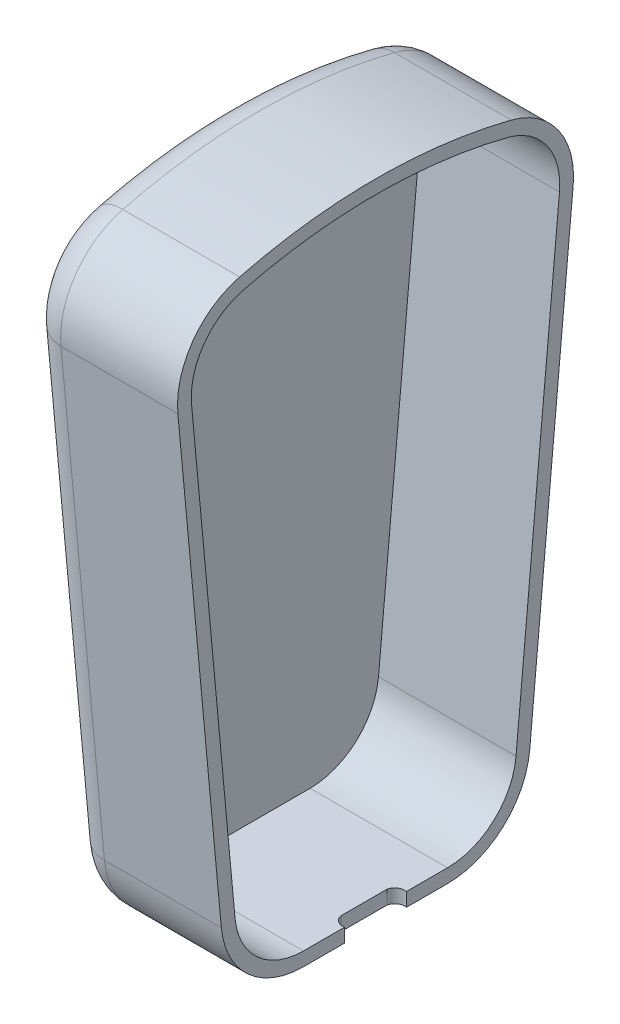
ISO-10303-21;
HEADER;
FILE_DESCRIPTION(('STEP AP214'),'2;1');
FILE_NAME('part.step','',(''),(''),'','','');
FILE_SCHEMA(('AUTOMOTIVE_DESIGN { 1 0 10303 214 1 1 1 1 }'));
ENDSEC;
DATA;
#1=APPLICATION_CONTEXT('core data for automotive mechanical design processes');
#2=APPLICATION_PROTOCOL_DEFINITION('international standard','automotive_design',2000,#1);
#3=PRODUCT_CONTEXT('',#1,'mechanical');
#4=PRODUCT('Part','Part','',(#3));
#5=PRODUCT_RELATED_PRODUCT_CATEGORY('part','',(#4));
#6=PRODUCT_DEFINITION_FORMATION('','',#4);
#7=PRODUCT_DEFINITION_CONTEXT('part definition',#1,'design');
#8=PRODUCT_DEFINITION('design','',#6,#7);
#9=PRODUCT_DEFINITION_SHAPE('','',#8);
#10=(LENGTH_UNIT() NAMED_UNIT(*) SI_UNIT(.MILLI.,.METRE.));
#11=(NAMED_UNIT(*) PLANE_ANGLE_UNIT() SI_UNIT($,.RADIAN.));
#12=(NAMED_UNIT(*) SI_UNIT($,.STERADIAN.) SOLID_ANGLE_UNIT());
#13=UNCERTAINTY_MEASURE_WITH_UNIT(LENGTH_MEASURE(1.E-05),#10,'distance_accuracy_value','');
#14=(GEOMETRIC_REPRESENTATION_CONTEXT(3) GLOBAL_UNCERTAINTY_ASSIGNED_CONTEXT((#13)) GLOBAL_UNIT_ASSIGNED_CONTEXT((#10,
#11,#12)) REPRESENTATION_CONTEXT('',''));
#15=CARTESIAN_POINT('',(0.,0.,0.));
#16=DIRECTION('',(0.,0.,1.));
#17=DIRECTION('',(1.,0.,0.));
#18=AXIS2_PLACEMENT_3D('',#15,#16,#17);
#19=CARTESIAN_POINT('',(20.,31.8416043189372,16.7955360291633));
#20=DIRECTION('',(-1.,0.,0.));
#21=DIRECTION('',(0.,0.,1.));
#22=AXIS2_PLACEMENT_3D('',#19,#20,#21);
#23=CYLINDRICAL_SURFACE('',#22,12.);
#24=DIRECTION('',(-1.,0.,0.));
#25=VECTOR('',#24,1.);
#26=CARTESIAN_POINT('',(20.,43.471195783068,19.7540157700801));
#27=LINE('',#26,#25);
#28=CARTESIAN_POINT('',(20.,43.471195783068,19.7540157700801));
#29=VERTEX_POINT('',#28);
#30=CARTESIAN_POINT('',(3.,43.471195783068,19.7540157700801));
#31=VERTEX_POINT('',#30);
#32=EDGE_CURVE('E334',#29,#31,#27,.T.);
#33=ORIENTED_EDGE('',*,*,#32,.T.);
#34=CARTESIAN_POINT('',(3.,31.8416043189372,16.7955360291633));
#35=DIRECTION('',(1.,0.,0.));
#36=DIRECTION('',(0.,0.,-1.));
#37=AXIS2_PLACEMENT_3D('',#34,#35,#36);
#38=CIRCLE('',#37,12.);
#39=CARTESIAN_POINT('',(2.99999999999999,30.7292959193274,28.7438735714391));
#40=VERTEX_POINT('',#39);
#41=EDGE_CURVE('E11',#31,#40,#38,.T.);
#42=ORIENTED_EDGE('',*,*,#41,.T.);
#43=DIRECTION('',(1.,0.,0.));
#44=VECTOR('',#43,1.);
#45=CARTESIAN_POINT('',(20.,30.7292959193274,28.7438735714391));
#46=LINE('',#45,#44);
#47=CARTESIAN_POINT('',(20.,30.7292959193274,28.7438735714391));
#48=VERTEX_POINT('',#47);
#49=EDGE_CURVE('E329',#48,#40,#46,.F.);
#50=ORIENTED_EDGE('',*,*,#49,.F.);
#51=CARTESIAN_POINT('',(20.,31.8416043189372,16.7955360291633));
#52=DIRECTION('',(1.,0.,0.));
#53=DIRECTION('',(0.,0.,-1.));
#54=AXIS2_PLACEMENT_3D('',#51,#52,#53);
#55=CIRCLE('',#54,12.);
#56=EDGE_CURVE('E328',#29,#48,#55,.T.);
#57=ORIENTED_EDGE('',*,*,#56,.F.);
#58=EDGE_LOOP('',(#33,#42,#50,#57));
#59=FACE_BOUND('',#58,.T.);
#60=ADVANCED_FACE('F39',(#59),#23,.T.);
#61=CARTESIAN_POINT('',(20.,30.7292959193274,28.7438735714391));
#62=DIRECTION('',(0.,0.0926923666341485,-0.995694795189651));
#63=DIRECTION('',(0.,0.995694795189651,0.0926923666341485));
#64=AXIS2_PLACEMENT_3D('',#61,#62,#63);
#65=PLANE('',#64);
#66=ORIENTED_EDGE('',*,*,#49,.T.);
#67=DIRECTION('',(0.,-0.995694795189651,-0.0926923666341485));
#68=VECTOR('',#67,1.);
#69=CARTESIAN_POINT('',(3.,30.7292959193274,28.7438735714391));
#70=LINE('',#69,#68);
#71=CARTESIAN_POINT('',(3.,-37.1678639551653,22.4231129659715));
#72=VERTEX_POINT('',#71);
#73=EDGE_CURVE('E49',#40,#72,#70,.T.);
#74=ORIENTED_EDGE('',*,*,#73,.T.);
#75=DIRECTION('',(-1.,0.,0.));
#76=VECTOR('',#75,1.);
#77=CARTESIAN_POINT('',(20.,-37.1678639551653,22.4231129659715));
#78=LINE('',#77,#76);
#79=CARTESIAN_POINT('',(20.,-37.1678639551653,22.4231129659715));
#80=VERTEX_POINT('',#79);
#81=EDGE_CURVE('E333',#80,#72,#78,.T.);
#82=ORIENTED_EDGE('',*,*,#81,.F.);
#83=DIRECTION('',(0.,-0.995694795189651,-0.0926923666341485));
#84=VECTOR('',#83,1.);
#85=CARTESIAN_POINT('',(20.,30.7292959193274,28.7438735714391));
#86=LINE('',#85,#84);
#87=EDGE_CURVE('E364',#48,#80,#86,.T.);
#88=ORIENTED_EDGE('',*,*,#87,.F.);
#89=EDGE_LOOP('',(#66,#74,#82,#88));
#90=FACE_BOUND('',#89,.T.);
#91=ADVANCED_FACE('F535',(#90),#65,.F.);
#92=CARTESIAN_POINT('',(20.,-36.0555555555556,10.4747754236957));
#93=DIRECTION('',(-1.,0.,0.));
#94=DIRECTION('',(0.,0.,1.));
#95=AXIS2_PLACEMENT_3D('',#92,#93,#94);
#96=CYLINDRICAL_SURFACE('',#95,12.);
#97=ORIENTED_EDGE('',*,*,#81,.T.);
#98=CARTESIAN_POINT('',(3.,-36.0555555555556,10.4747754236957));
#99=DIRECTION('',(1.,0.,0.));
#100=DIRECTION('',(0.,0.,-1.));
#101=AXIS2_PLACEMENT_3D('',#98,#99,#100);
#102=CIRCLE('',#101,12.);
#103=CARTESIAN_POINT('',(3.,-48.0555555555556,10.4747754236956));
#104=VERTEX_POINT('',#103);
#105=EDGE_CURVE('E426',#72,#104,#102,.T.);
#106=ORIENTED_EDGE('',*,*,#105,.T.);
#107=DIRECTION('',(1.,0.,0.));
#108=VECTOR('',#107,1.);
#109=CARTESIAN_POINT('',(20.,-48.0555555555556,10.4747754236956));
#110=LINE('',#109,#108);
#111=CARTESIAN_POINT('',(20.,-48.0555555555556,10.4747754236956));
#112=VERTEX_POINT('',#111);
#113=EDGE_CURVE('E342',#112,#104,#110,.F.);
#114=ORIENTED_EDGE('',*,*,#113,.F.);
#115=CARTESIAN_POINT('',(20.,-36.0555555555556,10.4747754236957));
#116=DIRECTION('',(1.,0.,0.));
#117=DIRECTION('',(0.,0.,-1.));
#118=AXIS2_PLACEMENT_3D('',#115,#116,#117);
#119=CIRCLE('',#118,12.);
#120=EDGE_CURVE('E367',#80,#112,#119,.T.);
#121=ORIENTED_EDGE('',*,*,#120,.F.);
#122=EDGE_LOOP('',(#97,#106,#114,#121));
#123=FACE_BOUND('',#122,.T.);
#124=ADVANCED_FACE('F511',(#123),#96,.T.);
#125=CARTESIAN_POINT('',(20.,-48.0555555555556,10.4747754236956));
#126=DIRECTION('',(0.,1.,0.));
#127=DIRECTION('',(0.,0.,1.));
#128=AXIS2_PLACEMENT_3D('',#125,#126,#127);
#129=PLANE('',#128);
#130=DIRECTION('',(0.,0.,-1.));
#131=VECTOR('',#130,1.);
#132=CARTESIAN_POINT('',(20.,-48.0555555555556,10.4747754236956));
#133=LINE('',#132,#131);
#134=CARTESIAN_POINT('',(20.,-48.0555555555556,-4.50000000000001));
#135=VERTEX_POINT('',#134);
#136=CARTESIAN_POINT('',(20.,-48.0555555555556,-10.4747754236956));
#137=VERTEX_POINT('',#136);
#138=EDGE_CURVE('E370',#135,#137,#133,.T.);
#139=ORIENTED_EDGE('',*,*,#138,.F.);
#140=CARTESIAN_POINT('',(19.7275,-48.0555555555556,-3.0725));
#141=DIRECTION('',(0.,-1.,0.));
#142=DIRECTION('',(0.,0.,-1.));
#143=AXIS2_PLACEMENT_3D('',#140,#141,#142);
#144=CIRCLE('',#143,1.45327647060015);
#145=CARTESIAN_POINT('',(18.3,-48.0555555555556,-3.345));
#146=VERTEX_POINT('',#145);
#147=EDGE_CURVE('E227',#146,#135,#144,.T.);
#148=ORIENTED_EDGE('',*,*,#147,.F.);
#149=DIRECTION('',(0.,0.,-1.));
#150=VECTOR('',#149,1.);
#151=CARTESIAN_POINT('',(18.3,-48.0555555555556,-3.345));
#152=LINE('',#151,#150);
#153=CARTESIAN_POINT('',(18.3,-48.0555555555556,3.345));
#154=VERTEX_POINT('',#153);
#155=EDGE_CURVE('E219',#154,#146,#152,.T.);
#156=ORIENTED_EDGE('',*,*,#155,.F.);
#157=CARTESIAN_POINT('',(19.7275,-48.0555555555556,3.07249999999998));
#158=DIRECTION('',(0.,-1.,0.));
#159=DIRECTION('',(0.,0.,1.));
#160=AXIS2_PLACEMENT_3D('',#157,#158,#159);
#161=CIRCLE('',#160,1.45327647060015);
#162=CARTESIAN_POINT('',(20.,-48.0555555555556,4.5));
#163=VERTEX_POINT('',#162);
#164=EDGE_CURVE('E233',#163,#154,#161,.T.);
#165=ORIENTED_EDGE('',*,*,#164,.F.);
#166=EDGE_CURVE('E371',#112,#163,#133,.T.);
#167=ORIENTED_EDGE('',*,*,#166,.F.);
#168=ORIENTED_EDGE('',*,*,#113,.T.);
#169=DIRECTION('',(0.,0.,-1.));
#170=VECTOR('',#169,1.);
#171=CARTESIAN_POINT('',(3.,-48.0555555555556,10.4747754236956));
#172=LINE('',#171,#170);
#173=CARTESIAN_POINT('',(3.,-48.0555555555556,-10.4747754236956));
#174=VERTEX_POINT('',#173);
#175=EDGE_CURVE('E423',#104,#174,#172,.T.);
#176=ORIENTED_EDGE('',*,*,#175,.T.);
#177=DIRECTION('',(-1.,0.,0.));
#178=VECTOR('',#177,1.);
#179=CARTESIAN_POINT('',(20.,-48.0555555555556,-10.4747754236956));
#180=LINE('',#179,#178);
#181=EDGE_CURVE('E346',#137,#174,#180,.T.);
#182=ORIENTED_EDGE('',*,*,#181,.F.);
#183=EDGE_LOOP('',(#139,#148,#156,#165,#167,#168,#176,#182));
#184=FACE_BOUND('',#183,.T.);
#185=ADVANCED_FACE('F505',(#184),#129,.F.);
#186=CARTESIAN_POINT('',(20.,-36.0555555555556,-10.4747754236957));
#187=DIRECTION('',(-1.,0.,0.));
#188=DIRECTION('',(0.,0.,1.));
#189=AXIS2_PLACEMENT_3D('',#186,#187,#188);
#190=CYLINDRICAL_SURFACE('',#189,12.);
#191=ORIENTED_EDGE('',*,*,#181,.T.);
#192=CARTESIAN_POINT('',(3.,-36.0555555555556,-10.4747754236957));
#193=DIRECTION('',(1.,0.,0.));
#194=DIRECTION('',(0.,0.,-1.));
#195=AXIS2_PLACEMENT_3D('',#192,#193,#194);
#196=CIRCLE('',#195,12.);
#197=CARTESIAN_POINT('',(2.99999999999999,-37.1678639551653,-22.4231129659715));
#198=VERTEX_POINT('',#197);
#199=EDGE_CURVE('E420',#174,#198,#196,.T.);
#200=ORIENTED_EDGE('',*,*,#199,.T.);
#201=DIRECTION('',(1.,0.,0.));
#202=VECTOR('',#201,1.);
#203=CARTESIAN_POINT('',(20.,-37.1678639551653,-22.4231129659715));
#204=LINE('',#203,#202);
#205=CARTESIAN_POINT('',(20.,-37.1678639551653,-22.4231129659715));
#206=VERTEX_POINT('',#205);
#207=EDGE_CURVE('E350',#206,#198,#204,.F.);
#208=ORIENTED_EDGE('',*,*,#207,.F.);
#209=CARTESIAN_POINT('',(20.,-36.0555555555556,-10.4747754236957));
#210=DIRECTION('',(1.,0.,0.));
#211=DIRECTION('',(0.,0.,-1.));
#212=AXIS2_PLACEMENT_3D('',#209,#210,#211);
#213=CIRCLE('',#212,12.);
#214=EDGE_CURVE('E375',#137,#206,#213,.T.);
#215=ORIENTED_EDGE('',*,*,#214,.F.);
#216=EDGE_LOOP('',(#191,#200,#208,#215));
#217=FACE_BOUND('',#216,.T.);
#218=ADVANCED_FACE('F501',(#217),#190,.T.);
#219=CARTESIAN_POINT('',(20.,30.7292959193274,-28.7438735714391));
#220=DIRECTION('',(0.,0.0926923666341485,0.995694795189651));
#221=DIRECTION('',(0.,-0.995694795189651,0.0926923666341485));
#222=AXIS2_PLACEMENT_3D('',#219,#220,#221);
#223=PLANE('',#222);
#224=ORIENTED_EDGE('',*,*,#207,.T.);
#225=DIRECTION('',(0.,0.995694795189651,-0.0926923666341485));
#226=VECTOR('',#225,1.);
#227=CARTESIAN_POINT('',(3.,30.7292959193274,-28.7438735714391));
#228=LINE('',#227,#226);
#229=CARTESIAN_POINT('',(3.,30.7292959193274,-28.7438735714391));
#230=VERTEX_POINT('',#229);
#231=EDGE_CURVE('E417',#198,#230,#228,.T.);
#232=ORIENTED_EDGE('',*,*,#231,.T.);
#233=DIRECTION('',(-1.,0.,0.));
#234=VECTOR('',#233,1.);
#235=CARTESIAN_POINT('',(20.,30.7292959193274,-28.7438735714391));
#236=LINE('',#235,#234);
#237=CARTESIAN_POINT('',(20.,30.7292959193274,-28.7438735714391));
#238=VERTEX_POINT('',#237);
#239=EDGE_CURVE('E354',#238,#230,#236,.T.);
#240=ORIENTED_EDGE('',*,*,#239,.F.);
#241=DIRECTION('',(0.,0.995694795189651,-0.0926923666341485));
#242=VECTOR('',#241,1.);
#243=CARTESIAN_POINT('',(20.,30.7292959193274,-28.7438735714391));
#244=LINE('',#243,#242);
#245=EDGE_CURVE('E378',#206,#238,#244,.T.);
#246=ORIENTED_EDGE('',*,*,#245,.F.);
#247=EDGE_LOOP('',(#224,#232,#240,#246));
#248=FACE_BOUND('',#247,.T.);
#249=ADVANCED_FACE('F499',(#248),#223,.F.);
#250=CARTESIAN_POINT('',(20.,31.8416043189372,-16.7955360291633));
#251=DIRECTION('',(-1.,0.,0.));
#252=DIRECTION('',(0.,0.,1.));
#253=AXIS2_PLACEMENT_3D('',#250,#251,#252);
#254=CYLINDRICAL_SURFACE('',#253,12.);
#255=ORIENTED_EDGE('',*,*,#239,.T.);
#256=CARTESIAN_POINT('',(3.,31.8416043189372,-16.7955360291633));
#257=DIRECTION('',(1.,0.,0.));
#258=DIRECTION('',(0.,0.,-1.));
#259=AXIS2_PLACEMENT_3D('',#256,#257,#258);
#260=CIRCLE('',#259,12.);
#261=CARTESIAN_POINT('',(3.,43.471195783068,-19.7540157700801));
#262=VERTEX_POINT('',#261);
#263=EDGE_CURVE('E414',#230,#262,#260,.T.);
#264=ORIENTED_EDGE('',*,*,#263,.T.);
#265=DIRECTION('',(-1.,0.,0.));
#266=VECTOR('',#265,1.);
#267=CARTESIAN_POINT('',(20.,43.471195783068,-19.7540157700801));
#268=LINE('',#267,#266);
#269=CARTESIAN_POINT('',(20.,43.471195783068,-19.7540157700801));
#270=VERTEX_POINT('',#269);
#271=EDGE_CURVE('E337',#270,#262,#268,.T.);
#272=ORIENTED_EDGE('',*,*,#271,.F.);
#273=CARTESIAN_POINT('',(20.,31.8416043189372,-16.7955360291633));
#274=DIRECTION('',(1.,0.,0.));
#275=DIRECTION('',(0.,0.,-1.));
#276=AXIS2_PLACEMENT_3D('',#273,#274,#275);
#277=CIRCLE('',#276,12.);
#278=EDGE_CURVE('E381',#238,#270,#277,.T.);
#279=ORIENTED_EDGE('',*,*,#278,.F.);
#280=EDGE_LOOP('',(#255,#264,#272,#279));
#281=FACE_BOUND('',#280,.T.);
#282=ADVANCED_FACE('F485',(#281),#254,.T.);
#283=CARTESIAN_POINT('',(20.,-34.1805555555557,0.));
#284=DIRECTION('',(-1.,0.,0.));
#285=DIRECTION('',(0.,0.,1.));
#286=AXIS2_PLACEMENT_3D('',#283,#284,#285);
#287=CYLINDRICAL_SURFACE('',#286,80.1250000000001);
#288=ORIENTED_EDGE('',*,*,#271,.T.);
#289=CARTESIAN_POINT('',(3.,-34.1805555555557,0.));
#290=DIRECTION('',(1.,0.,0.));
#291=DIRECTION('',(0.,0.,-1.));
#292=AXIS2_PLACEMENT_3D('',#289,#290,#291);
#293=CIRCLE('',#292,80.1250000000001);
#294=EDGE_CURVE('E332',#262,#31,#293,.T.);
#295=ORIENTED_EDGE('',*,*,#294,.T.);
#296=ORIENTED_EDGE('',*,*,#32,.F.);
#297=CARTESIAN_POINT('',(20.,-34.1805555555557,0.));
#298=DIRECTION('',(1.,0.,0.));
#299=DIRECTION('',(0.,0.,-1.));
#300=AXIS2_PLACEMENT_3D('',#297,#298,#299);
#301=CIRCLE('',#300,80.1250000000001);
#302=EDGE_CURVE('E338',#270,#29,#301,.T.);
#303=ORIENTED_EDGE('',*,*,#302,.F.);
#304=EDGE_LOOP('',(#288,#295,#296,#303));
#305=FACE_BOUND('',#304,.T.);
#306=ADVANCED_FACE('F490',(#305),#287,.T.);
#307=CARTESIAN_POINT('',(20.,31.8416043189372,16.7955360291633));
#308=DIRECTION('',(1.,0.,0.));
#309=DIRECTION('',(0.,0.,-1.));
#310=AXIS2_PLACEMENT_3D('',#307,#308,#309);
#311=PLANE('',#310);
#312=DIRECTION('',(0.,-1.,0.));
#313=VECTOR('',#312,1.);
#314=CARTESIAN_POINT('',(20.,-36.8457449903294,-4.50000000000001));
#315=LINE('',#314,#313);
#316=CARTESIAN_POINT('',(20.,-46.0555555555556,-4.50000000000001));
#317=VERTEX_POINT('',#316);
#318=EDGE_CURVE('E208',#317,#135,#315,.T.);
#319=ORIENTED_EDGE('',*,*,#318,.T.);
#320=ORIENTED_EDGE('',*,*,#138,.T.);
#321=ORIENTED_EDGE('',*,*,#214,.T.);
#322=ORIENTED_EDGE('',*,*,#245,.T.);
#323=ORIENTED_EDGE('',*,*,#278,.T.);
#324=ORIENTED_EDGE('',*,*,#302,.T.);
#325=ORIENTED_EDGE('',*,*,#56,.T.);
#326=ORIENTED_EDGE('',*,*,#87,.T.);
#327=ORIENTED_EDGE('',*,*,#120,.T.);
#328=ORIENTED_EDGE('',*,*,#166,.T.);
#329=DIRECTION('',(0.,-1.,0.));
#330=VECTOR('',#329,1.);
#331=CARTESIAN_POINT('',(20.,-36.8457449903294,4.5));
#332=LINE('',#331,#330);
#333=CARTESIAN_POINT('',(20.,-46.0555555555556,4.5));
#334=VERTEX_POINT('',#333);
#335=EDGE_CURVE('E236',#334,#163,#332,.T.);
#336=ORIENTED_EDGE('',*,*,#335,.F.);
#337=DIRECTION('',(0.,0.,-1.));
#338=VECTOR('',#337,1.);
#339=CARTESIAN_POINT('',(20.,-46.0555555555556,10.4747754236956));
#340=LINE('',#339,#338);
#341=CARTESIAN_POINT('',(20.,-46.0555555555556,10.4747754236956));
#342=VERTEX_POINT('',#341);
#343=EDGE_CURVE('E256',#342,#334,#340,.T.);
#344=ORIENTED_EDGE('',*,*,#343,.F.);
#345=CARTESIAN_POINT('',(20.,-36.0555555555556,10.4747754236957));
#346=DIRECTION('',(1.,0.,0.));
#347=DIRECTION('',(0.,0.,1.));
#348=AXIS2_PLACEMENT_3D('',#345,#346,#347);
#349=CIRCLE('',#348,10.);
#350=CARTESIAN_POINT('',(20.,-36.982479221897,20.4317233755922));
#351=VERTEX_POINT('',#350);
#352=EDGE_CURVE('E252',#351,#342,#349,.T.);
#353=ORIENTED_EDGE('',*,*,#352,.F.);
#354=DIRECTION('',(0.,-0.995694795189651,-0.0926923666341485));
#355=VECTOR('',#354,1.);
#356=CARTESIAN_POINT('',(20.,30.9146806525957,26.7524839810598));
#357=LINE('',#356,#355);
#358=CARTESIAN_POINT('',(20.,30.9146806525957,26.7524839810598));
#359=VERTEX_POINT('',#358);
#360=EDGE_CURVE('E248',#359,#351,#357,.T.);
#361=ORIENTED_EDGE('',*,*,#360,.F.);
#362=CARTESIAN_POINT('',(20.,31.8416043189372,16.7955360291633));
#363=DIRECTION('',(1.,0.,0.));
#364=DIRECTION('',(0.,0.,-1.));
#365=AXIS2_PLACEMENT_3D('',#362,#363,#364);
#366=CIRCLE('',#365,10.);
#367=CARTESIAN_POINT('',(20.,41.5329305390462,19.2609358132607));
#368=VERTEX_POINT('',#367);
#369=EDGE_CURVE('E245',#368,#359,#366,.T.);
#370=ORIENTED_EDGE('',*,*,#369,.F.);
#371=CARTESIAN_POINT('',(20.,-34.1805555555557,0.));
#372=DIRECTION('',(1.,0.,0.));
#373=DIRECTION('',(0.,0.,1.));
#374=AXIS2_PLACEMENT_3D('',#371,#372,#373);
#375=CIRCLE('',#374,78.1250000000001);
#376=CARTESIAN_POINT('',(20.,41.5329305390462,-19.2609358132606));
#377=VERTEX_POINT('',#376);
#378=EDGE_CURVE('E269',#377,#368,#375,.T.);
#379=ORIENTED_EDGE('',*,*,#378,.F.);
#380=CARTESIAN_POINT('',(20.,31.8416043189372,-16.7955360291633));
#381=DIRECTION('',(1.,0.,0.));
#382=DIRECTION('',(0.,0.,1.));
#383=AXIS2_PLACEMENT_3D('',#380,#381,#382);
#384=CIRCLE('',#383,10.);
#385=CARTESIAN_POINT('',(20.,30.9146806525957,-26.7524839810598));
#386=VERTEX_POINT('',#385);
#387=EDGE_CURVE('E265',#386,#377,#384,.T.);
#388=ORIENTED_EDGE('',*,*,#387,.F.);
#389=DIRECTION('',(0.,0.995694795189651,-0.0926923666341485));
#390=VECTOR('',#389,1.);
#391=CARTESIAN_POINT('',(20.,30.9146806525957,-26.7524839810598));
#392=LINE('',#391,#390);
#393=CARTESIAN_POINT('',(20.,-36.982479221897,-20.4317233755922));
#394=VERTEX_POINT('',#393);
#395=EDGE_CURVE('E262',#394,#386,#392,.T.);
#396=ORIENTED_EDGE('',*,*,#395,.F.);
#397=CARTESIAN_POINT('',(20.,-36.0555555555556,-10.4747754236957));
#398=DIRECTION('',(1.,0.,0.));
#399=DIRECTION('',(0.,0.,1.));
#400=AXIS2_PLACEMENT_3D('',#397,#398,#399);
#401=CIRCLE('',#400,10.);
#402=CARTESIAN_POINT('',(20.,-46.0555555555556,-10.4747754236956));
#403=VERTEX_POINT('',#402);
#404=EDGE_CURVE('E259',#403,#394,#401,.T.);
#405=ORIENTED_EDGE('',*,*,#404,.F.);
#406=EDGE_CURVE('E255',#317,#403,#340,.T.);
#407=ORIENTED_EDGE('',*,*,#406,.F.);
#408=EDGE_LOOP('',(#319,#320,#321,#322,#323,#324,#325,#326,#327,#328,#336,#344,#353,#361,#370,
#379,#388,#396,#405,#407));
#409=FACE_BOUND('',#408,.T.);
#410=ADVANCED_FACE('F494',(#409),#311,.T.);
#411=CARTESIAN_POINT('',(-2.,31.8416043189372,16.7955360291633));
#412=DIRECTION('',(1.,0.,0.));
#413=DIRECTION('',(0.,0.,-1.));
#414=AXIS2_PLACEMENT_3D('',#411,#412,#413);
#415=PLANE('',#414);
#416=CARTESIAN_POINT('',(-2.,31.8416043189372,16.7955360291633));
#417=DIRECTION('',(1.,0.,0.));
#418=DIRECTION('',(0.,0.,-1.));
#419=AXIS2_PLACEMENT_3D('',#416,#417,#418);
#420=CIRCLE('',#419,7.00000000000001);
#421=CARTESIAN_POINT('',(-2.,31.1927577524981,23.7653995954908));
#422=VERTEX_POINT('',#421);
#423=CARTESIAN_POINT('',(-2.,38.6255326730135,18.5213158780314));
#424=VERTEX_POINT('',#423);
#425=EDGE_CURVE('E389',#422,#424,#420,.F.);
#426=ORIENTED_EDGE('',*,*,#425,.T.);
#427=CARTESIAN_POINT('',(-2.,-34.1805555555557,0.));
#428=DIRECTION('',(1.,0.,0.));
#429=DIRECTION('',(0.,0.,-1.));
#430=AXIS2_PLACEMENT_3D('',#427,#428,#429);
#431=CIRCLE('',#430,75.1250000000001);
#432=CARTESIAN_POINT('',(-2.,38.6255326730135,-18.5213158780314));
#433=VERTEX_POINT('',#432);
#434=EDGE_CURVE('E410',#424,#433,#431,.F.);
#435=ORIENTED_EDGE('',*,*,#434,.T.);
#436=CARTESIAN_POINT('',(-2.,31.8416043189372,-16.7955360291633));
#437=DIRECTION('',(1.,0.,0.));
#438=DIRECTION('',(0.,0.,-1.));
#439=AXIS2_PLACEMENT_3D('',#436,#437,#438);
#440=CIRCLE('',#439,7.00000000000001);
#441=CARTESIAN_POINT('',(-2.,31.1927577524981,-23.7653995954908));
#442=VERTEX_POINT('',#441);
#443=EDGE_CURVE('E407',#433,#442,#440,.F.);
#444=ORIENTED_EDGE('',*,*,#443,.T.);
#445=DIRECTION('',(0.,0.995694795189651,-0.0926923666341485));
#446=VECTOR('',#445,1.);
#447=CARTESIAN_POINT('',(-2.,28.0925266261759,-23.476789308885));
#448=LINE('',#447,#446);
#449=CARTESIAN_POINT('',(-2.,-36.7044021219945,-17.4446389900232));
#450=VERTEX_POINT('',#449);
#451=EDGE_CURVE('E404',#442,#450,#448,.F.);
#452=ORIENTED_EDGE('',*,*,#451,.T.);
#453=CARTESIAN_POINT('',(-2.,-36.0555555555556,-10.4747754236957));
#454=DIRECTION('',(1.,0.,0.));
#455=DIRECTION('',(0.,0.,-1.));
#456=AXIS2_PLACEMENT_3D('',#453,#454,#455);
#457=CIRCLE('',#456,7.);
#458=CARTESIAN_POINT('',(-2.,-43.0555555555556,-10.4747754236956));
#459=VERTEX_POINT('',#458);
#460=EDGE_CURVE('E401',#450,#459,#457,.F.);
#461=ORIENTED_EDGE('',*,*,#460,.T.);
#462=DIRECTION('',(0.,0.,-1.));
#463=VECTOR('',#462,1.);
#464=CARTESIAN_POINT('',(-2.,-43.0555555555556,16.7955360291633));
#465=LINE('',#464,#463);
#466=CARTESIAN_POINT('',(-2.,-43.0555555555556,10.4747754236956));
#467=VERTEX_POINT('',#466);
#468=EDGE_CURVE('E398',#459,#467,#465,.F.);
#469=ORIENTED_EDGE('',*,*,#468,.T.);
#470=CARTESIAN_POINT('',(-2.,-36.0555555555556,10.4747754236957));
#471=DIRECTION('',(1.,0.,0.));
#472=DIRECTION('',(0.,0.,-1.));
#473=AXIS2_PLACEMENT_3D('',#470,#471,#472);
#474=CIRCLE('',#473,7.);
#475=CARTESIAN_POINT('',(-2.,-36.7044021219946,17.4446389900232));
#476=VERTEX_POINT('',#475);
#477=EDGE_CURVE('E395',#467,#476,#474,.F.);
#478=ORIENTED_EDGE('',*,*,#477,.T.);
#479=DIRECTION('',(0.,-0.995694795189651,-0.0926923666341485));
#480=VECTOR('',#479,1.);
#481=CARTESIAN_POINT('',(-2.,31.1927577524981,23.7653995954908));
#482=LINE('',#481,#480);
#483=EDGE_CURVE('E392',#476,#422,#482,.F.);
#484=ORIENTED_EDGE('',*,*,#483,.T.);
#485=EDGE_LOOP('',(#426,#435,#444,#452,#461,#469,#478,#484));
#486=FACE_BOUND('',#485,.T.);
#487=ADVANCED_FACE('F470',(#486),#415,.F.);
#488=CARTESIAN_POINT('',(20.,31.8416043189372,16.7955360291633));
#489=DIRECTION('',(-1.,0.,0.));
#490=DIRECTION('',(0.,0.,1.));
#491=AXIS2_PLACEMENT_3D('',#488,#489,#490);
#492=CYLINDRICAL_SURFACE('',#491,10.);
#493=CARTESIAN_POINT('',(0.,31.8416043189372,16.7955360291633));
#494=DIRECTION('',(1.,0.,0.));
#495=DIRECTION('',(0.,0.,-1.));
#496=AXIS2_PLACEMENT_3D('',#493,#494,#495);
#497=CIRCLE('',#496,10.);
#498=CARTESIAN_POINT('',(0.,41.5329305390462,19.2609358132607));
#499=VERTEX_POINT('',#498);
#500=CARTESIAN_POINT('',(0.,30.9146806525957,26.7524839810598));
#501=VERTEX_POINT('',#500);
#502=EDGE_CURVE('E273',#499,#501,#497,.T.);
#503=ORIENTED_EDGE('',*,*,#502,.F.);
#504=DIRECTION('',(-1.,0.,0.));
#505=VECTOR('',#504,1.);
#506=CARTESIAN_POINT('',(20.,41.5329305390462,19.2609358132607));
#507=LINE('',#506,#505);
#508=EDGE_CURVE('E272',#368,#499,#507,.T.);
#509=ORIENTED_EDGE('',*,*,#508,.F.);
#510=ORIENTED_EDGE('',*,*,#369,.T.);
#511=DIRECTION('',(-1.,0.,0.));
#512=VECTOR('',#511,1.);
#513=CARTESIAN_POINT('',(20.,30.9146806525957,26.7524839810598));
#514=LINE('',#513,#512);
#515=EDGE_CURVE('E324',#359,#501,#514,.T.);
#516=ORIENTED_EDGE('',*,*,#515,.T.);
#517=EDGE_LOOP('',(#503,#509,#510,#516));
#518=FACE_BOUND('',#517,.T.);
#519=ADVANCED_FACE('F558',(#518),#492,.F.);
#520=CARTESIAN_POINT('',(20.,30.9146806525957,26.7524839810598));
#521=DIRECTION('',(0.,0.0926923666341485,-0.995694795189651));
#522=DIRECTION('',(0.,0.995694795189651,0.0926923666341485));
#523=AXIS2_PLACEMENT_3D('',#520,#521,#522);
#524=PLANE('',#523);
#525=DIRECTION('',(0.,-0.995694795189651,-0.0926923666341485));
#526=VECTOR('',#525,1.);
#527=CARTESIAN_POINT('',(0.,30.9146806525957,26.7524839810598));
#528=LINE('',#527,#526);
#529=CARTESIAN_POINT('',(0.,-36.982479221897,20.4317233755922));
#530=VERTEX_POINT('',#529);
#531=EDGE_CURVE('E277',#501,#530,#528,.T.);
#532=ORIENTED_EDGE('',*,*,#531,.F.);
#533=ORIENTED_EDGE('',*,*,#515,.F.);
#534=ORIENTED_EDGE('',*,*,#360,.T.);
#535=DIRECTION('',(-1.,0.,0.));
#536=VECTOR('',#535,1.);
#537=CARTESIAN_POINT('',(20.,-36.982479221897,20.4317233755922));
#538=LINE('',#537,#536);
#539=EDGE_CURVE('E320',#351,#530,#538,.T.);
#540=ORIENTED_EDGE('',*,*,#539,.T.);
#541=EDGE_LOOP('',(#532,#533,#534,#540));
#542=FACE_BOUND('',#541,.T.);
#543=ADVANCED_FACE('F563',(#542),#524,.T.);
#544=CARTESIAN_POINT('',(20.,-36.0555555555556,10.4747754236957));
#545=DIRECTION('',(-1.,0.,0.));
#546=DIRECTION('',(0.,0.,1.));
#547=AXIS2_PLACEMENT_3D('',#544,#545,#546);
#548=CYLINDRICAL_SURFACE('',#547,10.);
#549=CARTESIAN_POINT('',(0.,-36.0555555555556,10.4747754236957));
#550=DIRECTION('',(1.,0.,0.));
#551=DIRECTION('',(0.,0.,1.));
#552=AXIS2_PLACEMENT_3D('',#549,#550,#551);
#553=CIRCLE('',#552,10.);
#554=CARTESIAN_POINT('',(0.,-46.0555555555556,10.4747754236956));
#555=VERTEX_POINT('',#554);
#556=EDGE_CURVE('E280',#530,#555,#553,.T.);
#557=ORIENTED_EDGE('',*,*,#556,.F.);
#558=ORIENTED_EDGE('',*,*,#539,.F.);
#559=ORIENTED_EDGE('',*,*,#352,.T.);
#560=DIRECTION('',(-1.,0.,0.));
#561=VECTOR('',#560,1.);
#562=CARTESIAN_POINT('',(20.,-46.0555555555556,10.4747754236956));
#563=LINE('',#562,#561);
#564=EDGE_CURVE('E316',#342,#555,#563,.T.);
#565=ORIENTED_EDGE('',*,*,#564,.T.);
#566=EDGE_LOOP('',(#557,#558,#559,#565));
#567=FACE_BOUND('',#566,.T.);
#568=ADVANCED_FACE('F577',(#567),#548,.F.);
#569=CARTESIAN_POINT('',(20.,-46.0555555555556,10.4747754236956));
#570=DIRECTION('',(0.,1.,0.));
#571=DIRECTION('',(0.,0.,1.));
#572=AXIS2_PLACEMENT_3D('',#569,#570,#571);
#573=PLANE('',#572);
#574=CARTESIAN_POINT('',(19.7275,-46.0555555555556,-3.0725));
#575=DIRECTION('',(0.,1.,0.));
#576=DIRECTION('',(0.,0.,1.));
#577=AXIS2_PLACEMENT_3D('',#574,#575,#576);
#578=CIRCLE('',#577,1.45327647060015);
#579=CARTESIAN_POINT('',(18.3,-46.0555555555556,-3.345));
#580=VERTEX_POINT('',#579);
#581=EDGE_CURVE('E202',#580,#317,#578,.F.);
#582=ORIENTED_EDGE('',*,*,#581,.T.);
#583=ORIENTED_EDGE('',*,*,#406,.T.);
#584=DIRECTION('',(-1.,0.,0.));
#585=VECTOR('',#584,1.);
#586=CARTESIAN_POINT('',(20.,-46.0555555555556,-10.4747754236956));
#587=LINE('',#586,#585);
#588=CARTESIAN_POINT('',(0.,-46.0555555555556,-10.4747754236956));
#589=VERTEX_POINT('',#588);
#590=EDGE_CURVE('E312',#403,#589,#587,.T.);
#591=ORIENTED_EDGE('',*,*,#590,.T.);
#592=DIRECTION('',(0.,0.,-1.));
#593=VECTOR('',#592,1.);
#594=CARTESIAN_POINT('',(0.,-46.0555555555556,10.4747754236956));
#595=LINE('',#594,#593);
#596=EDGE_CURVE('E283',#555,#589,#595,.T.);
#597=ORIENTED_EDGE('',*,*,#596,.F.);
#598=ORIENTED_EDGE('',*,*,#564,.F.);
#599=ORIENTED_EDGE('',*,*,#343,.T.);
#600=CARTESIAN_POINT('',(19.7275,-46.0555555555556,3.07249999999998));
#601=DIRECTION('',(0.,1.,0.));
#602=DIRECTION('',(0.,0.,1.));
#603=AXIS2_PLACEMENT_3D('',#600,#601,#602);
#604=CIRCLE('',#603,1.45327647060015);
#605=CARTESIAN_POINT('',(18.3,-46.0555555555556,3.345));
#606=VERTEX_POINT('',#605);
#607=EDGE_CURVE('E225',#334,#606,#604,.F.);
#608=ORIENTED_EDGE('',*,*,#607,.T.);
#609=DIRECTION('',(0.,0.,-1.));
#610=VECTOR('',#609,1.);
#611=CARTESIAN_POINT('',(18.3,-46.0555555555556,-3.345));
#612=LINE('',#611,#610);
#613=EDGE_CURVE('E216',#606,#580,#612,.T.);
#614=ORIENTED_EDGE('',*,*,#613,.T.);
#615=EDGE_LOOP('',(#582,#583,#591,#597,#598,#599,#608,#614));
#616=FACE_BOUND('',#615,.T.);
#617=ADVANCED_FACE('F223',(#616),#573,.T.);
#618=CARTESIAN_POINT('',(20.,-36.0555555555556,-10.4747754236957));
#619=DIRECTION('',(-1.,0.,0.));
#620=DIRECTION('',(0.,0.,1.));
#621=AXIS2_PLACEMENT_3D('',#618,#619,#620);
#622=CYLINDRICAL_SURFACE('',#621,10.);
#623=CARTESIAN_POINT('',(0.,-36.0555555555556,-10.4747754236957));
#624=DIRECTION('',(1.,0.,0.));
#625=DIRECTION('',(0.,0.,1.));
#626=AXIS2_PLACEMENT_3D('',#623,#624,#625);
#627=CIRCLE('',#626,10.);
#628=CARTESIAN_POINT('',(0.,-36.982479221897,-20.4317233755922));
#629=VERTEX_POINT('',#628);
#630=EDGE_CURVE('E286',#589,#629,#627,.T.);
#631=ORIENTED_EDGE('',*,*,#630,.F.);
#632=ORIENTED_EDGE('',*,*,#590,.F.);
#633=ORIENTED_EDGE('',*,*,#404,.T.);
#634=DIRECTION('',(-1.,0.,0.));
#635=VECTOR('',#634,1.);
#636=CARTESIAN_POINT('',(20.,-36.982479221897,-20.4317233755922));
#637=LINE('',#636,#635);
#638=EDGE_CURVE('E308',#394,#629,#637,.T.);
#639=ORIENTED_EDGE('',*,*,#638,.T.);
#640=EDGE_LOOP('',(#631,#632,#633,#639));
#641=FACE_BOUND('',#640,.T.);
#642=ADVANCED_FACE('F576',(#641),#622,.F.);
#643=CARTESIAN_POINT('',(20.,30.9146806525957,-26.7524839810598));
#644=DIRECTION('',(0.,0.0926923666341485,0.995694795189651));
#645=DIRECTION('',(0.,-0.995694795189651,0.0926923666341485));
#646=AXIS2_PLACEMENT_3D('',#643,#644,#645);
#647=PLANE('',#646);
#648=DIRECTION('',(0.,0.995694795189651,-0.0926923666341485));
#649=VECTOR('',#648,1.);
#650=CARTESIAN_POINT('',(0.,30.9146806525957,-26.7524839810598));
#651=LINE('',#650,#649);
#652=CARTESIAN_POINT('',(0.,30.9146806525957,-26.7524839810598));
#653=VERTEX_POINT('',#652);
#654=EDGE_CURVE('E289',#629,#653,#651,.T.);
#655=ORIENTED_EDGE('',*,*,#654,.F.);
#656=ORIENTED_EDGE('',*,*,#638,.F.);
#657=ORIENTED_EDGE('',*,*,#395,.T.);
#658=DIRECTION('',(-1.,0.,0.));
#659=VECTOR('',#658,1.);
#660=CARTESIAN_POINT('',(20.,30.9146806525957,-26.7524839810598));
#661=LINE('',#660,#659);
#662=EDGE_CURVE('E304',#386,#653,#661,.T.);
#663=ORIENTED_EDGE('',*,*,#662,.T.);
#664=EDGE_LOOP('',(#655,#656,#657,#663));
#665=FACE_BOUND('',#664,.T.);
#666=ADVANCED_FACE('F620',(#665),#647,.T.);
#667=CARTESIAN_POINT('',(20.,31.8416043189372,-16.7955360291633));
#668=DIRECTION('',(-1.,0.,0.));
#669=DIRECTION('',(0.,0.,1.));
#670=AXIS2_PLACEMENT_3D('',#667,#668,#669);
#671=CYLINDRICAL_SURFACE('',#670,10.);
#672=CARTESIAN_POINT('',(0.,31.8416043189372,-16.7955360291633));
#673=DIRECTION('',(1.,0.,0.));
#674=DIRECTION('',(0.,0.,1.));
#675=AXIS2_PLACEMENT_3D('',#672,#673,#674);
#676=CIRCLE('',#675,10.);
#677=CARTESIAN_POINT('',(0.,41.5329305390462,-19.2609358132606));
#678=VERTEX_POINT('',#677);
#679=EDGE_CURVE('E292',#653,#678,#676,.T.);
#680=ORIENTED_EDGE('',*,*,#679,.F.);
#681=ORIENTED_EDGE('',*,*,#662,.F.);
#682=ORIENTED_EDGE('',*,*,#387,.T.);
#683=DIRECTION('',(-1.,0.,0.));
#684=VECTOR('',#683,1.);
#685=CARTESIAN_POINT('',(20.,41.5329305390462,-19.2609358132606));
#686=LINE('',#685,#684);
#687=EDGE_CURVE('E300',#377,#678,#686,.T.);
#688=ORIENTED_EDGE('',*,*,#687,.T.);
#689=EDGE_LOOP('',(#680,#681,#682,#688));
#690=FACE_BOUND('',#689,.T.);
#691=ADVANCED_FACE('F616',(#690),#671,.F.);
#692=CARTESIAN_POINT('',(20.,-34.1805555555557,0.));
#693=DIRECTION('',(-1.,0.,0.));
#694=DIRECTION('',(0.,0.,1.));
#695=AXIS2_PLACEMENT_3D('',#692,#693,#694);
#696=CYLINDRICAL_SURFACE('',#695,78.1250000000001);
#697=CARTESIAN_POINT('',(0.,-34.1805555555557,0.));
#698=DIRECTION('',(1.,0.,0.));
#699=DIRECTION('',(0.,0.,1.));
#700=AXIS2_PLACEMENT_3D('',#697,#698,#699);
#701=CIRCLE('',#700,78.1250000000001);
#702=EDGE_CURVE('E249',#678,#499,#701,.T.);
#703=ORIENTED_EDGE('',*,*,#702,.F.);
#704=ORIENTED_EDGE('',*,*,#687,.F.);
#705=ORIENTED_EDGE('',*,*,#378,.T.);
#706=ORIENTED_EDGE('',*,*,#508,.T.);
#707=EDGE_LOOP('',(#703,#704,#705,#706));
#708=FACE_BOUND('',#707,.T.);
#709=ADVANCED_FACE('F612',(#708),#696,.F.);
#710=CARTESIAN_POINT('',(0.,31.8416043189372,16.7955360291633));
#711=DIRECTION('',(1.,0.,0.));
#712=DIRECTION('',(0.,0.,-1.));
#713=AXIS2_PLACEMENT_3D('',#710,#711,#712);
#714=PLANE('',#713);
#715=ORIENTED_EDGE('',*,*,#502,.T.);
#716=ORIENTED_EDGE('',*,*,#531,.T.);
#717=ORIENTED_EDGE('',*,*,#556,.T.);
#718=ORIENTED_EDGE('',*,*,#596,.T.);
#719=ORIENTED_EDGE('',*,*,#630,.T.);
#720=ORIENTED_EDGE('',*,*,#654,.T.);
#721=ORIENTED_EDGE('',*,*,#679,.T.);
#722=ORIENTED_EDGE('',*,*,#702,.T.);
#723=EDGE_LOOP('',(#715,#716,#717,#718,#719,#720,#721,#722));
#724=FACE_BOUND('',#723,.T.);
#725=ADVANCED_FACE('F609',(#724),#714,.T.);
#726=CARTESIAN_POINT('',(3.,-43.0555555555556,10.4747754236956));
#727=DIRECTION('',(0.,0.,-1.));
#728=DIRECTION('',(-1.,0.,0.));
#729=AXIS2_PLACEMENT_3D('',#726,#727,#728);
#730=CYLINDRICAL_SURFACE('',#729,5.);
#731=CARTESIAN_POINT('',(3.,-43.0555555555556,10.4747754236956));
#732=DIRECTION('',(0.,0.,1.));
#733=DIRECTION('',(1.,0.,0.));
#734=AXIS2_PLACEMENT_3D('',#731,#732,#733);
#735=CIRCLE('',#734,5.);
#736=EDGE_CURVE('E451',#467,#104,#735,.T.);
#737=ORIENTED_EDGE('',*,*,#736,.F.);
#738=ORIENTED_EDGE('',*,*,#468,.F.);
#739=CARTESIAN_POINT('',(3.,-43.0555555555556,-10.4747754236956));
#740=DIRECTION('',(0.,0.,-1.));
#741=DIRECTION('',(-1.,0.,0.));
#742=AXIS2_PLACEMENT_3D('',#739,#740,#741);
#743=CIRCLE('',#742,5.);
#744=EDGE_CURVE('E43',#174,#459,#743,.T.);
#745=ORIENTED_EDGE('',*,*,#744,.F.);
#746=ORIENTED_EDGE('',*,*,#175,.F.);
#747=EDGE_LOOP('',(#737,#738,#745,#746));
#748=FACE_BOUND('',#747,.T.);
#749=ADVANCED_FACE('F41',(#748),#730,.T.);
#750=CARTESIAN_POINT('',(3.,-36.0555555555556,-10.4747754236957));
#751=DIRECTION('',(1.,0.,0.));
#752=DIRECTION('',(0.,0.,-1.));
#753=AXIS2_PLACEMENT_3D('',#750,#751,#752);
#754=TOROIDAL_SURFACE('',#753,7.,5.);
#755=ORIENTED_EDGE('',*,*,#744,.T.);
#756=ORIENTED_EDGE('',*,*,#460,.F.);
#757=CARTESIAN_POINT('',(3.,-36.7044021219946,-17.4446389900232));
#758=DIRECTION('',(0.,0.995694795189651,-0.0926923666341436));
#759=DIRECTION('',(0.,0.0926923666341436,0.995694795189651));
#760=AXIS2_PLACEMENT_3D('',#757,#758,#759);
#761=CIRCLE('',#760,5.);
#762=EDGE_CURVE('E448',#198,#450,#761,.T.);
#763=ORIENTED_EDGE('',*,*,#762,.F.);
#764=ORIENTED_EDGE('',*,*,#199,.F.);
#765=EDGE_LOOP('',(#755,#756,#763,#764));
#766=FACE_BOUND('',#765,.T.);
#767=ADVANCED_FACE('F464',(#766),#754,.T.);
#768=CARTESIAN_POINT('',(3.,-36.0555555555556,10.4747754236957));
#769=DIRECTION('',(1.,0.,0.));
#770=DIRECTION('',(0.,0.,-1.));
#771=AXIS2_PLACEMENT_3D('',#768,#769,#770);
#772=TOROIDAL_SURFACE('',#771,7.,5.);
#773=ORIENTED_EDGE('',*,*,#736,.T.);
#774=ORIENTED_EDGE('',*,*,#105,.F.);
#775=CARTESIAN_POINT('',(3.,-36.7044021219946,17.4446389900232));
#776=DIRECTION('',(0.,0.995694795189651,0.0926923666341423));
#777=DIRECTION('',(0.,-0.0926923666341423,0.995694795189651));
#778=AXIS2_PLACEMENT_3D('',#775,#776,#777);
#779=CIRCLE('',#778,5.);
#780=EDGE_CURVE('E444',#476,#72,#779,.T.);
#781=ORIENTED_EDGE('',*,*,#780,.F.);
#782=ORIENTED_EDGE('',*,*,#477,.F.);
#783=EDGE_LOOP('',(#773,#774,#781,#782));
#784=FACE_BOUND('',#783,.T.);
#785=ADVANCED_FACE('F513',(#784),#772,.T.);
#786=CARTESIAN_POINT('',(3.,31.1927577524981,-23.7653995954908));
#787=DIRECTION('',(0.,0.995694795189651,-0.0926923666341485));
#788=DIRECTION('',(0.,0.0926923666341485,0.995694795189651));
#789=AXIS2_PLACEMENT_3D('',#786,#787,#788);
#790=CYLINDRICAL_SURFACE('',#789,5.);
#791=ORIENTED_EDGE('',*,*,#762,.T.);
#792=ORIENTED_EDGE('',*,*,#451,.F.);
#793=CARTESIAN_POINT('',(3.,31.1927577524981,-23.7653995954908));
#794=DIRECTION('',(0.,0.995694795189651,-0.0926923666341485));
#795=DIRECTION('',(0.,0.0926923666341485,0.995694795189651));
#796=AXIS2_PLACEMENT_3D('',#793,#794,#795);
#797=CIRCLE('',#796,5.);
#798=EDGE_CURVE('E440',#230,#442,#797,.T.);
#799=ORIENTED_EDGE('',*,*,#798,.F.);
#800=ORIENTED_EDGE('',*,*,#231,.F.);
#801=EDGE_LOOP('',(#791,#792,#799,#800));
#802=FACE_BOUND('',#801,.T.);
#803=ADVANCED_FACE('F476',(#802),#790,.T.);
#804=CARTESIAN_POINT('',(3.,31.1927577524981,23.7653995954908));
#805=DIRECTION('',(0.,-0.995694795189651,-0.0926923666341485));
#806=DIRECTION('',(0.,0.0926923666341485,-0.995694795189651));
#807=AXIS2_PLACEMENT_3D('',#804,#805,#806);
#808=CYLINDRICAL_SURFACE('',#807,5.);
#809=ORIENTED_EDGE('',*,*,#780,.T.);
#810=ORIENTED_EDGE('',*,*,#73,.F.);
#811=CARTESIAN_POINT('',(3.,31.1927577524981,23.7653995954908));
#812=DIRECTION('',(0.,0.995694795189651,0.0926923666341485));
#813=DIRECTION('',(0.,-0.0926923666341485,0.995694795189651));
#814=AXIS2_PLACEMENT_3D('',#811,#812,#813);
#815=CIRCLE('',#814,5.);
#816=EDGE_CURVE('E436',#422,#40,#815,.T.);
#817=ORIENTED_EDGE('',*,*,#816,.F.);
#818=ORIENTED_EDGE('',*,*,#483,.F.);
#819=EDGE_LOOP('',(#809,#810,#817,#818));
#820=FACE_BOUND('',#819,.T.);
#821=ADVANCED_FACE('F517',(#820),#808,.T.);
#822=CARTESIAN_POINT('',(3.,31.8416043189372,-16.7955360291633));
#823=DIRECTION('',(1.,0.,0.));
#824=DIRECTION('',(0.,0.,-1.));
#825=AXIS2_PLACEMENT_3D('',#822,#823,#824);
#826=TOROIDAL_SURFACE('',#825,7.00000000000001,5.);
#827=ORIENTED_EDGE('',*,*,#798,.T.);
#828=ORIENTED_EDGE('',*,*,#443,.F.);
#829=CARTESIAN_POINT('',(3.,38.6255326730135,-18.5213158780314));
#830=DIRECTION('',(0.,0.246539978409736,0.969132622010902));
#831=DIRECTION('',(0.,-0.969132622010902,0.246539978409736));
#832=AXIS2_PLACEMENT_3D('',#829,#830,#831);
#833=CIRCLE('',#832,5.);
#834=EDGE_CURVE('E433',#262,#433,#833,.T.);
#835=ORIENTED_EDGE('',*,*,#834,.F.);
#836=ORIENTED_EDGE('',*,*,#263,.F.);
#837=EDGE_LOOP('',(#827,#828,#835,#836));
#838=FACE_BOUND('',#837,.T.);
#839=ADVANCED_FACE('F480',(#838),#826,.T.);
#840=CARTESIAN_POINT('',(3.,31.8416043189372,16.7955360291633));
#841=DIRECTION('',(1.,0.,0.));
#842=DIRECTION('',(0.,0.,-1.));
#843=AXIS2_PLACEMENT_3D('',#840,#841,#842);
#844=TOROIDAL_SURFACE('',#843,7.00000000000001,5.);
#845=ORIENTED_EDGE('',*,*,#816,.T.);
#846=ORIENTED_EDGE('',*,*,#41,.F.);
#847=CARTESIAN_POINT('',(3.,38.6255326730135,18.5213158780314));
#848=DIRECTION('',(0.,0.246539978409736,-0.969132622010903));
#849=DIRECTION('',(0.,0.969132622010903,0.246539978409736));
#850=AXIS2_PLACEMENT_3D('',#847,#848,#849);
#851=CIRCLE('',#850,5.);
#852=EDGE_CURVE('E244',#424,#31,#851,.T.);
#853=ORIENTED_EDGE('',*,*,#852,.F.);
#854=ORIENTED_EDGE('',*,*,#425,.F.);
#855=EDGE_LOOP('',(#845,#846,#853,#854));
#856=FACE_BOUND('',#855,.T.);
#857=ADVANCED_FACE('F525',(#856),#844,.T.);
#858=CARTESIAN_POINT('',(3.,-34.1805555555557,0.));
#859=DIRECTION('',(1.,0.,0.));
#860=DIRECTION('',(0.,0.,-1.));
#861=AXIS2_PLACEMENT_3D('',#858,#859,#860);
#862=TOROIDAL_SURFACE('',#861,75.1250000000001,5.);
#863=ORIENTED_EDGE('',*,*,#834,.T.);
#864=ORIENTED_EDGE('',*,*,#434,.F.);
#865=ORIENTED_EDGE('',*,*,#852,.T.);
#866=ORIENTED_EDGE('',*,*,#294,.F.);
#867=EDGE_LOOP('',(#863,#864,#865,#866));
#868=FACE_BOUND('',#867,.T.);
#869=ADVANCED_FACE('F524',(#868),#862,.T.);
#870=CARTESIAN_POINT('',(18.3,-36.8457449903294,-3.345));
#871=DIRECTION('',(-1.,0.,0.));
#872=DIRECTION('',(0.,0.,1.));
#873=AXIS2_PLACEMENT_3D('',#870,#871,#872);
#874=PLANE('',#873);
#875=DIRECTION('',(0.,-1.,0.));
#876=VECTOR('',#875,1.);
#877=CARTESIAN_POINT('',(18.3,-36.8457449903294,3.345));
#878=LINE('',#877,#876);
#879=EDGE_CURVE('E57',#606,#154,#878,.T.);
#880=ORIENTED_EDGE('',*,*,#879,.T.);
#881=ORIENTED_EDGE('',*,*,#155,.T.);
#882=DIRECTION('',(0.,-1.,0.));
#883=VECTOR('',#882,1.);
#884=CARTESIAN_POINT('',(18.3,-36.8457449903294,-3.345));
#885=LINE('',#884,#883);
#886=EDGE_CURVE('E205',#580,#146,#885,.T.);
#887=ORIENTED_EDGE('',*,*,#886,.F.);
#888=ORIENTED_EDGE('',*,*,#613,.F.);
#889=EDGE_LOOP('',(#880,#881,#887,#888));
#890=FACE_BOUND('',#889,.T.);
#891=ADVANCED_FACE('F215',(#890),#874,.F.);
#892=CARTESIAN_POINT('',(19.7275,-36.8457449903294,-3.0725));
#893=DIRECTION('',(0.,-1.,0.));
#894=DIRECTION('',(0.,0.,-1.));
#895=AXIS2_PLACEMENT_3D('',#892,#893,#894);
#896=CYLINDRICAL_SURFACE('',#895,1.45327647060015);
#897=ORIENTED_EDGE('',*,*,#886,.T.);
#898=ORIENTED_EDGE('',*,*,#147,.T.);
#899=ORIENTED_EDGE('',*,*,#318,.F.);
#900=ORIENTED_EDGE('',*,*,#581,.F.);
#901=EDGE_LOOP('',(#897,#898,#899,#900));
#902=FACE_BOUND('',#901,.T.);
#903=ADVANCED_FACE('F204',(#902),#896,.F.);
#904=CARTESIAN_POINT('',(19.7275,-36.8457449903294,3.07249999999998));
#905=DIRECTION('',(0.,-1.,0.));
#906=DIRECTION('',(0.,0.,-1.));
#907=AXIS2_PLACEMENT_3D('',#904,#905,#906);
#908=CYLINDRICAL_SURFACE('',#907,1.45327647060015);
#909=ORIENTED_EDGE('',*,*,#335,.T.);
#910=ORIENTED_EDGE('',*,*,#164,.T.);
#911=ORIENTED_EDGE('',*,*,#879,.F.);
#912=ORIENTED_EDGE('',*,*,#607,.F.);
#913=EDGE_LOOP('',(#909,#910,#911,#912));
#914=FACE_BOUND('',#913,.T.);
#915=ADVANCED_FACE('F596',(#914),#908,.F.);
#916=CLOSED_SHELL('',(#60,#91,#124,#185,#218,#249,#282,#306,#410,#487,#519,#543,#568,#617,#642,
#666,#691,#709,#725,#749,#767,#785,#803,#821,#839,#857,#869,#891,#903,#915));
#917=MANIFOLD_SOLID_BREP('B2',#916);
#918=ADVANCED_BREP_SHAPE_REPRESENTATION('',(#18,#917),#14);
#919=SHAPE_DEFINITION_REPRESENTATION(#9,#918);
ENDSEC;
END-ISO-10303-21;
